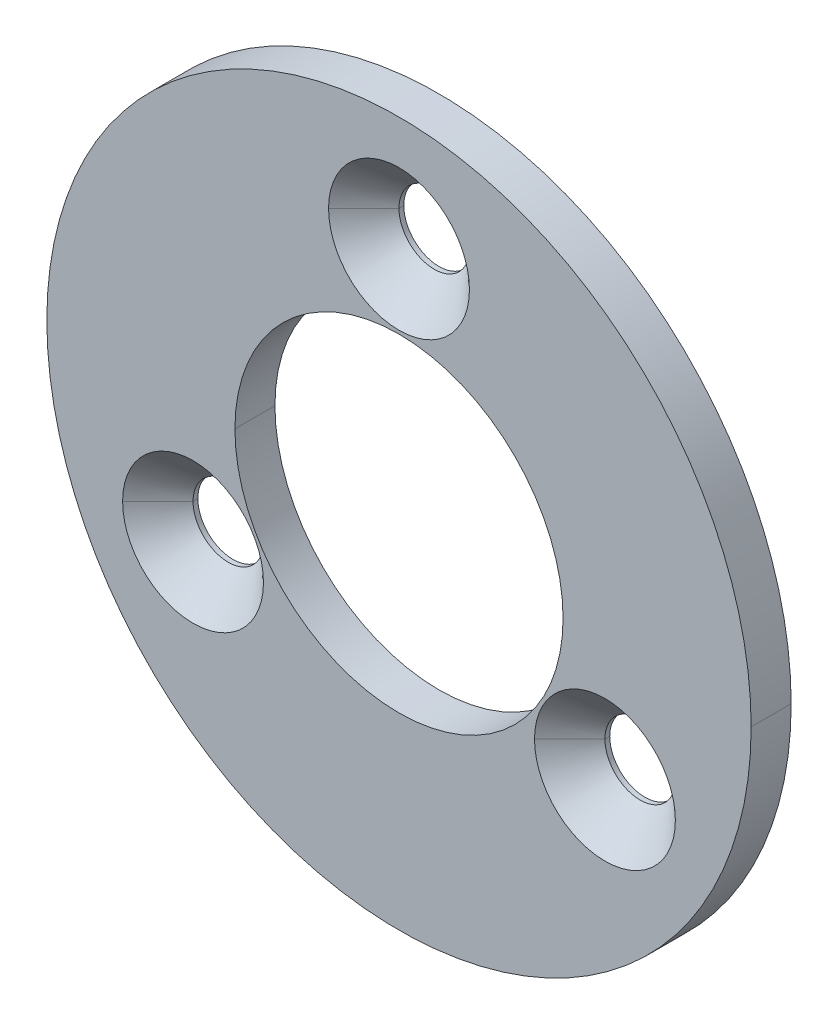
ISO-10303-21;
HEADER;
FILE_DESCRIPTION(('STEP AP214'),'2;1');
FILE_NAME('part.step','',(''),(''),'','','');
FILE_SCHEMA(('AUTOMOTIVE_DESIGN { 1 0 10303 214 1 1 1 1 }'));
ENDSEC;
DATA;
#1=APPLICATION_CONTEXT('core data for automotive mechanical design processes');
#2=APPLICATION_PROTOCOL_DEFINITION('international standard','automotive_design',2000,#1);
#3=PRODUCT_CONTEXT('',#1,'mechanical');
#4=PRODUCT('Part','Part','',(#3));
#5=PRODUCT_RELATED_PRODUCT_CATEGORY('part','',(#4));
#6=PRODUCT_DEFINITION_FORMATION('','',#4);
#7=PRODUCT_DEFINITION_CONTEXT('part definition',#1,'design');
#8=PRODUCT_DEFINITION('design','',#6,#7);
#9=PRODUCT_DEFINITION_SHAPE('','',#8);
#10=(LENGTH_UNIT() NAMED_UNIT(*) SI_UNIT(.MILLI.,.METRE.));
#11=(NAMED_UNIT(*) PLANE_ANGLE_UNIT() SI_UNIT($,.RADIAN.));
#12=(NAMED_UNIT(*) SI_UNIT($,.STERADIAN.) SOLID_ANGLE_UNIT());
#13=UNCERTAINTY_MEASURE_WITH_UNIT(LENGTH_MEASURE(1.E-05),#10,'distance_accuracy_value','');
#14=(GEOMETRIC_REPRESENTATION_CONTEXT(3) GLOBAL_UNCERTAINTY_ASSIGNED_CONTEXT((#13)) GLOBAL_UNIT_ASSIGNED_CONTEXT((#10,
#11,#12)) REPRESENTATION_CONTEXT('',''));
#15=CARTESIAN_POINT('',(0.,0.,0.));
#16=DIRECTION('',(0.,0.,1.));
#17=DIRECTION('',(1.,0.,0.));
#18=AXIS2_PLACEMENT_3D('',#15,#16,#17);
#19=CARTESIAN_POINT('',(0.,7.42820323027552,1.25));
#20=DIRECTION('',(0.,0.,1.));
#21=DIRECTION('',(1.,0.,0.));
#22=AXIS2_PLACEMENT_3D('',#19,#20,#21);
#23=CONICAL_SURFACE('',#22,2.2,0.785398163397449);
#24=DIRECTION('',(-0.707106781186548,0.,0.707106781186547));
#25=VECTOR('',#24,1.);
#26=CARTESIAN_POINT('',(-2.2,7.42820323027552,1.25));
#27=LINE('',#26,#25);
#28=CARTESIAN_POINT('',(-1.1,7.42820323027552,0.150000000000011));
#29=VERTEX_POINT('',#28);
#30=CARTESIAN_POINT('',(-2.2,7.42820323027552,1.25));
#31=VERTEX_POINT('',#30);
#32=EDGE_CURVE('E308',#29,#31,#27,.T.);
#33=ORIENTED_EDGE('',*,*,#32,.F.);
#34=CARTESIAN_POINT('',(0.,7.42820323027552,0.150000000000011));
#35=DIRECTION('',(0.,0.,1.));
#36=DIRECTION('',(1.,0.,0.));
#37=AXIS2_PLACEMENT_3D('',#34,#35,#36);
#38=CIRCLE('',#37,1.1);
#39=CARTESIAN_POINT('',(1.1,7.42820323027552,0.150000000000011));
#40=VERTEX_POINT('',#39);
#41=EDGE_CURVE('E11',#40,#29,#38,.T.);
#42=ORIENTED_EDGE('',*,*,#41,.F.);
#43=DIRECTION('',(0.707106781186548,0.,0.707106781186547));
#44=VECTOR('',#43,1.);
#45=CARTESIAN_POINT('',(2.2,7.42820323027552,1.25));
#46=LINE('',#45,#44);
#47=CARTESIAN_POINT('',(2.2,7.42820323027552,1.25));
#48=VERTEX_POINT('',#47);
#49=EDGE_CURVE('E215',#40,#48,#46,.T.);
#50=ORIENTED_EDGE('',*,*,#49,.T.);
#51=CARTESIAN_POINT('',(0.,7.42820323027552,1.25));
#52=DIRECTION('',(0.,0.,1.));
#53=DIRECTION('',(1.,0.,0.));
#54=AXIS2_PLACEMENT_3D('',#51,#52,#53);
#55=CIRCLE('',#54,2.2);
#56=EDGE_CURVE('E134',#48,#31,#55,.T.);
#57=ORIENTED_EDGE('',*,*,#56,.T.);
#58=EDGE_LOOP('',(#33,#42,#50,#57));
#59=FACE_BOUND('',#58,.T.);
#60=ADVANCED_FACE('F17',(#59),#23,.F.);
#61=CARTESIAN_POINT('',(0.,7.42820323027552,1.25));
#62=DIRECTION('',(0.,0.,1.));
#63=DIRECTION('',(1.,0.,0.));
#64=AXIS2_PLACEMENT_3D('',#61,#62,#63);
#65=CYLINDRICAL_SURFACE('',#64,1.1);
#66=DIRECTION('',(0.,0.,1.));
#67=VECTOR('',#66,1.);
#68=CARTESIAN_POINT('',(-1.1,7.42820323027552,1.25));
#69=LINE('',#68,#67);
#70=CARTESIAN_POINT('',(-1.1,7.42820323027552,0.));
#71=VERTEX_POINT('',#70);
#72=EDGE_CURVE('E271',#71,#29,#69,.T.);
#73=ORIENTED_EDGE('',*,*,#72,.F.);
#74=CARTESIAN_POINT('',(0.,7.42820323027552,0.));
#75=DIRECTION('',(0.,0.,1.));
#76=DIRECTION('',(1.,0.,0.));
#77=AXIS2_PLACEMENT_3D('',#74,#75,#76);
#78=CIRCLE('',#77,1.1);
#79=CARTESIAN_POINT('',(1.1,7.42820323027552,0.));
#80=VERTEX_POINT('',#79);
#81=EDGE_CURVE('E185',#80,#71,#78,.T.);
#82=ORIENTED_EDGE('',*,*,#81,.F.);
#83=DIRECTION('',(0.,0.,1.));
#84=VECTOR('',#83,1.);
#85=CARTESIAN_POINT('',(1.1,7.42820323027552,1.25));
#86=LINE('',#85,#84);
#87=EDGE_CURVE('E274',#80,#40,#86,.T.);
#88=ORIENTED_EDGE('',*,*,#87,.T.);
#89=ORIENTED_EDGE('',*,*,#41,.T.);
#90=EDGE_LOOP('',(#73,#82,#88,#89));
#91=FACE_BOUND('',#90,.T.);
#92=ADVANCED_FACE('F496',(#91),#65,.F.);
#93=CARTESIAN_POINT('',(6.43301270189222,-3.71410161513775,1.25));
#94=DIRECTION('',(0.,0.,1.));
#95=DIRECTION('',(1.,0.,0.));
#96=AXIS2_PLACEMENT_3D('',#93,#94,#95);
#97=CONICAL_SURFACE('',#96,2.2,0.785398163397449);
#98=DIRECTION('',(-0.707106781186548,0.,0.707106781186547));
#99=VECTOR('',#98,1.);
#100=CARTESIAN_POINT('',(4.23301270189222,-3.71410161513775,1.25));
#101=LINE('',#100,#99);
#102=CARTESIAN_POINT('',(5.33301270189222,-3.71410161513775,0.150000000000011));
#103=VERTEX_POINT('',#102);
#104=CARTESIAN_POINT('',(4.23301270189222,-3.71410161513775,1.25));
#105=VERTEX_POINT('',#104);
#106=EDGE_CURVE('E230',#103,#105,#101,.T.);
#107=ORIENTED_EDGE('',*,*,#106,.F.);
#108=CARTESIAN_POINT('',(6.43301270189222,-3.71410161513775,0.150000000000011));
#109=DIRECTION('',(0.,0.,1.));
#110=DIRECTION('',(1.,0.,0.));
#111=AXIS2_PLACEMENT_3D('',#108,#109,#110);
#112=CIRCLE('',#111,1.1);
#113=CARTESIAN_POINT('',(7.53301270189222,-3.71410161513775,0.150000000000011));
#114=VERTEX_POINT('',#113);
#115=EDGE_CURVE('E28',#114,#103,#112,.T.);
#116=ORIENTED_EDGE('',*,*,#115,.F.);
#117=DIRECTION('',(0.707106781186548,0.,0.707106781186547));
#118=VECTOR('',#117,1.);
#119=CARTESIAN_POINT('',(8.63301270189222,-3.71410161513775,1.25));
#120=LINE('',#119,#118);
#121=CARTESIAN_POINT('',(8.63301270189222,-3.71410161513775,1.25));
#122=VERTEX_POINT('',#121);
#123=EDGE_CURVE('E199',#114,#122,#120,.T.);
#124=ORIENTED_EDGE('',*,*,#123,.T.);
#125=CARTESIAN_POINT('',(6.43301270189222,-3.71410161513775,1.25));
#126=DIRECTION('',(0.,0.,1.));
#127=DIRECTION('',(1.,0.,0.));
#128=AXIS2_PLACEMENT_3D('',#125,#126,#127);
#129=CIRCLE('',#128,2.2);
#130=EDGE_CURVE('E69',#122,#105,#129,.T.);
#131=ORIENTED_EDGE('',*,*,#130,.T.);
#132=EDGE_LOOP('',(#107,#116,#124,#131));
#133=FACE_BOUND('',#132,.T.);
#134=ADVANCED_FACE('F492',(#133),#97,.F.);
#135=CARTESIAN_POINT('',(6.43301270189222,-3.71410161513775,1.25));
#136=DIRECTION('',(0.,0.,1.));
#137=DIRECTION('',(1.,0.,0.));
#138=AXIS2_PLACEMENT_3D('',#135,#136,#137);
#139=CYLINDRICAL_SURFACE('',#138,1.1);
#140=DIRECTION('',(0.,0.,1.));
#141=VECTOR('',#140,1.);
#142=CARTESIAN_POINT('',(5.33301270189222,-3.71410161513775,1.25));
#143=LINE('',#142,#141);
#144=CARTESIAN_POINT('',(5.33301270189222,-3.71410161513775,0.));
#145=VERTEX_POINT('',#144);
#146=EDGE_CURVE('E179',#145,#103,#143,.T.);
#147=ORIENTED_EDGE('',*,*,#146,.F.);
#148=CARTESIAN_POINT('',(6.43301270189222,-3.71410161513775,0.));
#149=DIRECTION('',(0.,0.,1.));
#150=DIRECTION('',(1.,0.,0.));
#151=AXIS2_PLACEMENT_3D('',#148,#149,#150);
#152=CIRCLE('',#151,1.1);
#153=CARTESIAN_POINT('',(7.53301270189222,-3.71410161513775,0.));
#154=VERTEX_POINT('',#153);
#155=EDGE_CURVE('E173',#154,#145,#152,.T.);
#156=ORIENTED_EDGE('',*,*,#155,.F.);
#157=DIRECTION('',(0.,0.,1.));
#158=VECTOR('',#157,1.);
#159=CARTESIAN_POINT('',(7.53301270189222,-3.71410161513775,1.25));
#160=LINE('',#159,#158);
#161=EDGE_CURVE('E176',#154,#114,#160,.T.);
#162=ORIENTED_EDGE('',*,*,#161,.T.);
#163=ORIENTED_EDGE('',*,*,#115,.T.);
#164=EDGE_LOOP('',(#147,#156,#162,#163));
#165=FACE_BOUND('',#164,.T.);
#166=ADVANCED_FACE('F175',(#165),#139,.F.);
#167=CARTESIAN_POINT('',(-6.43301270189222,-3.71410161513775,1.25));
#168=DIRECTION('',(0.,0.,1.));
#169=DIRECTION('',(1.,0.,0.));
#170=AXIS2_PLACEMENT_3D('',#167,#168,#169);
#171=CONICAL_SURFACE('',#170,2.2,0.785398163397449);
#172=DIRECTION('',(-0.707106781186548,0.,0.707106781186547));
#173=VECTOR('',#172,1.);
#174=CARTESIAN_POINT('',(-8.63301270189222,-3.71410161513775,1.25));
#175=LINE('',#174,#173);
#176=CARTESIAN_POINT('',(-7.53301270189222,-3.71410161513775,0.150000000000011));
#177=VERTEX_POINT('',#176);
#178=CARTESIAN_POINT('',(-8.63301270189222,-3.71410161513775,1.25));
#179=VERTEX_POINT('',#178);
#180=EDGE_CURVE('E224',#177,#179,#175,.T.);
#181=ORIENTED_EDGE('',*,*,#180,.F.);
#182=CARTESIAN_POINT('',(-6.43301270189222,-3.71410161513775,0.150000000000011));
#183=DIRECTION('',(0.,0.,1.));
#184=DIRECTION('',(1.,0.,0.));
#185=AXIS2_PLACEMENT_3D('',#182,#183,#184);
#186=CIRCLE('',#185,1.1);
#187=CARTESIAN_POINT('',(-5.33301270189222,-3.71410161513775,0.150000000000011));
#188=VERTEX_POINT('',#187);
#189=EDGE_CURVE('E158',#188,#177,#186,.T.);
#190=ORIENTED_EDGE('',*,*,#189,.F.);
#191=DIRECTION('',(0.707106781186548,0.,0.707106781186547));
#192=VECTOR('',#191,1.);
#193=CARTESIAN_POINT('',(-4.23301270189222,-3.71410161513775,1.25));
#194=LINE('',#193,#192);
#195=CARTESIAN_POINT('',(-4.23301270189222,-3.71410161513775,1.25));
#196=VERTEX_POINT('',#195);
#197=EDGE_CURVE('E223',#188,#196,#194,.T.);
#198=ORIENTED_EDGE('',*,*,#197,.T.);
#199=CARTESIAN_POINT('',(-6.43301270189222,-3.71410161513775,1.25));
#200=DIRECTION('',(0.,0.,1.));
#201=DIRECTION('',(1.,0.,0.));
#202=AXIS2_PLACEMENT_3D('',#199,#200,#201);
#203=CIRCLE('',#202,2.2);
#204=EDGE_CURVE('E227',#196,#179,#203,.T.);
#205=ORIENTED_EDGE('',*,*,#204,.T.);
#206=EDGE_LOOP('',(#181,#190,#198,#205));
#207=FACE_BOUND('',#206,.T.);
#208=ADVANCED_FACE('F19',(#207),#171,.F.);
#209=CARTESIAN_POINT('',(-6.43301270189222,-3.71410161513775,1.25));
#210=DIRECTION('',(0.,0.,1.));
#211=DIRECTION('',(1.,0.,0.));
#212=AXIS2_PLACEMENT_3D('',#209,#210,#211);
#213=CYLINDRICAL_SURFACE('',#212,1.1);
#214=DIRECTION('',(0.,0.,1.));
#215=VECTOR('',#214,1.);
#216=CARTESIAN_POINT('',(-7.53301270189222,-3.71410161513775,1.25));
#217=LINE('',#216,#215);
#218=CARTESIAN_POINT('',(-7.53301270189222,-3.71410161513775,0.));
#219=VERTEX_POINT('',#218);
#220=EDGE_CURVE('E298',#219,#177,#217,.T.);
#221=ORIENTED_EDGE('',*,*,#220,.F.);
#222=CARTESIAN_POINT('',(-6.43301270189222,-3.71410161513775,0.));
#223=DIRECTION('',(0.,0.,1.));
#224=DIRECTION('',(1.,0.,0.));
#225=AXIS2_PLACEMENT_3D('',#222,#223,#224);
#226=CIRCLE('',#225,1.1);
#227=CARTESIAN_POINT('',(-5.33301270189222,-3.71410161513775,0.));
#228=VERTEX_POINT('',#227);
#229=EDGE_CURVE('E184',#228,#219,#226,.T.);
#230=ORIENTED_EDGE('',*,*,#229,.F.);
#231=DIRECTION('',(0.,0.,1.));
#232=VECTOR('',#231,1.);
#233=CARTESIAN_POINT('',(-5.33301270189222,-3.71410161513775,1.25));
#234=LINE('',#233,#232);
#235=EDGE_CURVE('E295',#228,#188,#234,.T.);
#236=ORIENTED_EDGE('',*,*,#235,.T.);
#237=ORIENTED_EDGE('',*,*,#189,.T.);
#238=EDGE_LOOP('',(#221,#230,#236,#237));
#239=FACE_BOUND('',#238,.T.);
#240=ADVANCED_FACE('F506',(#239),#213,.F.);
#241=CARTESIAN_POINT('',(0.,0.,1.25));
#242=DIRECTION('',(0.,0.,-1.));
#243=DIRECTION('',(-1.,0.,0.));
#244=AXIS2_PLACEMENT_3D('',#241,#242,#243);
#245=CYLINDRICAL_SURFACE('',#244,5.125);
#246=DIRECTION('',(0.,0.,-1.));
#247=VECTOR('',#246,1.);
#248=CARTESIAN_POINT('',(5.125,0.,1.25));
#249=LINE('',#248,#247);
#250=CARTESIAN_POINT('',(5.125,0.,1.25));
#251=VERTEX_POINT('',#250);
#252=CARTESIAN_POINT('',(5.125,0.,0.));
#253=VERTEX_POINT('',#252);
#254=EDGE_CURVE('E262',#251,#253,#249,.T.);
#255=ORIENTED_EDGE('',*,*,#254,.F.);
#256=CARTESIAN_POINT('',(0.,0.,1.25));
#257=DIRECTION('',(0.,0.,1.));
#258=DIRECTION('',(1.,0.,0.));
#259=AXIS2_PLACEMENT_3D('',#256,#257,#258);
#260=CIRCLE('',#259,5.125);
#261=CARTESIAN_POINT('',(-5.125,0.,1.25));
#262=VERTEX_POINT('',#261);
#263=EDGE_CURVE('E214',#251,#262,#260,.T.);
#264=ORIENTED_EDGE('',*,*,#263,.T.);
#265=DIRECTION('',(0.,0.,-1.));
#266=VECTOR('',#265,1.);
#267=CARTESIAN_POINT('',(-5.125,0.,1.25));
#268=LINE('',#267,#266);
#269=CARTESIAN_POINT('',(-5.125,0.,0.));
#270=VERTEX_POINT('',#269);
#271=EDGE_CURVE('E270',#262,#270,#268,.T.);
#272=ORIENTED_EDGE('',*,*,#271,.T.);
#273=CARTESIAN_POINT('',(0.,0.,0.));
#274=DIRECTION('',(0.,0.,1.));
#275=DIRECTION('',(1.,0.,0.));
#276=AXIS2_PLACEMENT_3D('',#273,#274,#275);
#277=CIRCLE('',#276,5.125);
#278=EDGE_CURVE('E236',#253,#270,#277,.T.);
#279=ORIENTED_EDGE('',*,*,#278,.F.);
#280=EDGE_LOOP('',(#255,#264,#272,#279));
#281=FACE_BOUND('',#280,.T.);
#282=ADVANCED_FACE('F501',(#281),#245,.F.);
#283=CARTESIAN_POINT('',(0.,0.,1.25));
#284=DIRECTION('',(0.,0.,-1.));
#285=DIRECTION('',(-1.,0.,0.));
#286=AXIS2_PLACEMENT_3D('',#283,#284,#285);
#287=CYLINDRICAL_SURFACE('',#286,11.);
#288=DIRECTION('',(0.,0.,-1.));
#289=VECTOR('',#288,1.);
#290=CARTESIAN_POINT('',(11.,0.,1.25));
#291=LINE('',#290,#289);
#292=CARTESIAN_POINT('',(11.,0.,1.25));
#293=VERTEX_POINT('',#292);
#294=CARTESIAN_POINT('',(11.,0.,0.));
#295=VERTEX_POINT('',#294);
#296=EDGE_CURVE('E276',#293,#295,#291,.T.);
#297=ORIENTED_EDGE('',*,*,#296,.F.);
#298=CARTESIAN_POINT('',(0.,0.,1.25));
#299=DIRECTION('',(0.,0.,1.));
#300=DIRECTION('',(1.,0.,0.));
#301=AXIS2_PLACEMENT_3D('',#298,#299,#300);
#302=CIRCLE('',#301,11.);
#303=CARTESIAN_POINT('',(-11.,0.,1.25));
#304=VERTEX_POINT('',#303);
#305=EDGE_CURVE('E258',#304,#293,#302,.T.);
#306=ORIENTED_EDGE('',*,*,#305,.F.);
#307=DIRECTION('',(0.,0.,-1.));
#308=VECTOR('',#307,1.);
#309=CARTESIAN_POINT('',(-11.,0.,1.25));
#310=LINE('',#309,#308);
#311=CARTESIAN_POINT('',(-11.,0.,0.));
#312=VERTEX_POINT('',#311);
#313=EDGE_CURVE('E255',#304,#312,#310,.T.);
#314=ORIENTED_EDGE('',*,*,#313,.T.);
#315=CARTESIAN_POINT('',(0.,0.,0.));
#316=DIRECTION('',(0.,0.,1.));
#317=DIRECTION('',(1.,0.,0.));
#318=AXIS2_PLACEMENT_3D('',#315,#316,#317);
#319=CIRCLE('',#318,11.);
#320=EDGE_CURVE('E42',#312,#295,#319,.T.);
#321=ORIENTED_EDGE('',*,*,#320,.T.);
#322=EDGE_LOOP('',(#297,#306,#314,#321));
#323=FACE_BOUND('',#322,.T.);
#324=ADVANCED_FACE('F505',(#323),#287,.T.);
#325=CARTESIAN_POINT('',(0.,0.,0.));
#326=DIRECTION('',(0.,0.,1.));
#327=DIRECTION('',(0.,-1.,0.));
#328=AXIS2_PLACEMENT_3D('',#325,#326,#327);
#329=PLANE('',#328);
#330=CARTESIAN_POINT('',(0.,0.,0.));
#331=DIRECTION('',(0.,0.,1.));
#332=DIRECTION('',(1.,0.,0.));
#333=AXIS2_PLACEMENT_3D('',#330,#331,#332);
#334=CIRCLE('',#333,5.125);
#335=EDGE_CURVE('E266',#270,#253,#334,.T.);
#336=ORIENTED_EDGE('',*,*,#335,.T.);
#337=ORIENTED_EDGE('',*,*,#278,.T.);
#338=EDGE_LOOP('',(#336,#337));
#339=FACE_BOUND('',#338,.T.);
#340=ORIENTED_EDGE('',*,*,#229,.T.);
#341=CARTESIAN_POINT('',(-6.43301270189222,-3.71410161513775,0.));
#342=DIRECTION('',(0.,0.,1.));
#343=DIRECTION('',(1.,0.,0.));
#344=AXIS2_PLACEMENT_3D('',#341,#342,#343);
#345=CIRCLE('',#344,1.1);
#346=EDGE_CURVE('E304',#219,#228,#345,.T.);
#347=ORIENTED_EDGE('',*,*,#346,.T.);
#348=EDGE_LOOP('',(#340,#347));
#349=FACE_BOUND('',#348,.T.);
#350=ORIENTED_EDGE('',*,*,#155,.T.);
#351=CARTESIAN_POINT('',(6.43301270189222,-3.71410161513775,0.));
#352=DIRECTION('',(0.,0.,1.));
#353=DIRECTION('',(1.,0.,0.));
#354=AXIS2_PLACEMENT_3D('',#351,#352,#353);
#355=CIRCLE('',#354,1.1);
#356=EDGE_CURVE('E190',#145,#154,#355,.T.);
#357=ORIENTED_EDGE('',*,*,#356,.T.);
#358=EDGE_LOOP('',(#350,#357));
#359=FACE_BOUND('',#358,.T.);
#360=ORIENTED_EDGE('',*,*,#81,.T.);
#361=CARTESIAN_POINT('',(0.,7.42820323027552,0.));
#362=DIRECTION('',(0.,0.,1.));
#363=DIRECTION('',(1.,0.,0.));
#364=AXIS2_PLACEMENT_3D('',#361,#362,#363);
#365=CIRCLE('',#364,1.1);
#366=EDGE_CURVE('E21',#71,#80,#365,.T.);
#367=ORIENTED_EDGE('',*,*,#366,.T.);
#368=EDGE_LOOP('',(#360,#367));
#369=FACE_BOUND('',#368,.T.);
#370=ORIENTED_EDGE('',*,*,#320,.F.);
#371=CARTESIAN_POINT('',(0.,0.,0.));
#372=DIRECTION('',(0.,0.,1.));
#373=DIRECTION('',(1.,0.,0.));
#374=AXIS2_PLACEMENT_3D('',#371,#372,#373);
#375=CIRCLE('',#374,11.);
#376=EDGE_CURVE('E259',#295,#312,#375,.T.);
#377=ORIENTED_EDGE('',*,*,#376,.F.);
#378=EDGE_LOOP('',(#370,#377));
#379=FACE_BOUND('',#378,.T.);
#380=ADVANCED_FACE('F196',(#339,#349,#359,#369,#379),#329,.F.);
#381=CARTESIAN_POINT('',(0.,0.,1.25));
#382=DIRECTION('',(0.,0.,1.));
#383=DIRECTION('',(0.,-1.,0.));
#384=AXIS2_PLACEMENT_3D('',#381,#382,#383);
#385=PLANE('',#384);
#386=CARTESIAN_POINT('',(0.,0.,1.25));
#387=DIRECTION('',(0.,0.,1.));
#388=DIRECTION('',(1.,0.,0.));
#389=AXIS2_PLACEMENT_3D('',#386,#387,#388);
#390=CIRCLE('',#389,5.125);
#391=EDGE_CURVE('E210',#262,#251,#390,.T.);
#392=ORIENTED_EDGE('',*,*,#391,.F.);
#393=ORIENTED_EDGE('',*,*,#263,.F.);
#394=EDGE_LOOP('',(#392,#393));
#395=FACE_BOUND('',#394,.T.);
#396=ORIENTED_EDGE('',*,*,#204,.F.);
#397=CARTESIAN_POINT('',(-6.43301270189222,-3.71410161513775,1.25));
#398=DIRECTION('',(0.,0.,1.));
#399=DIRECTION('',(1.,0.,0.));
#400=AXIS2_PLACEMENT_3D('',#397,#398,#399);
#401=CIRCLE('',#400,2.2);
#402=EDGE_CURVE('E219',#179,#196,#401,.T.);
#403=ORIENTED_EDGE('',*,*,#402,.F.);
#404=EDGE_LOOP('',(#396,#403));
#405=FACE_BOUND('',#404,.T.);
#406=ORIENTED_EDGE('',*,*,#130,.F.);
#407=CARTESIAN_POINT('',(6.43301270189222,-3.71410161513775,1.25));
#408=DIRECTION('',(0.,0.,1.));
#409=DIRECTION('',(1.,0.,0.));
#410=AXIS2_PLACEMENT_3D('',#407,#408,#409);
#411=CIRCLE('',#410,2.2);
#412=EDGE_CURVE('E207',#105,#122,#411,.T.);
#413=ORIENTED_EDGE('',*,*,#412,.F.);
#414=EDGE_LOOP('',(#406,#413));
#415=FACE_BOUND('',#414,.T.);
#416=ORIENTED_EDGE('',*,*,#56,.F.);
#417=CARTESIAN_POINT('',(0.,7.42820323027552,1.25));
#418=DIRECTION('',(0.,0.,1.));
#419=DIRECTION('',(1.,0.,0.));
#420=AXIS2_PLACEMENT_3D('',#417,#418,#419);
#421=CIRCLE('',#420,2.2);
#422=EDGE_CURVE('E218',#31,#48,#421,.T.);
#423=ORIENTED_EDGE('',*,*,#422,.F.);
#424=EDGE_LOOP('',(#416,#423));
#425=FACE_BOUND('',#424,.T.);
#426=ORIENTED_EDGE('',*,*,#305,.T.);
#427=CARTESIAN_POINT('',(0.,0.,1.25));
#428=DIRECTION('',(0.,0.,1.));
#429=DIRECTION('',(1.,0.,0.));
#430=AXIS2_PLACEMENT_3D('',#427,#428,#429);
#431=CIRCLE('',#430,11.);
#432=EDGE_CURVE('E280',#293,#304,#431,.T.);
#433=ORIENTED_EDGE('',*,*,#432,.T.);
#434=EDGE_LOOP('',(#426,#433));
#435=FACE_BOUND('',#434,.T.);
#436=ADVANCED_FACE('F530',(#395,#405,#415,#425,#435),#385,.T.);
#437=CARTESIAN_POINT('',(0.,0.,1.25));
#438=DIRECTION('',(0.,0.,-1.));
#439=DIRECTION('',(-1.,0.,0.));
#440=AXIS2_PLACEMENT_3D('',#437,#438,#439);
#441=CYLINDRICAL_SURFACE('',#440,11.);
#442=ORIENTED_EDGE('',*,*,#432,.F.);
#443=ORIENTED_EDGE('',*,*,#296,.T.);
#444=ORIENTED_EDGE('',*,*,#376,.T.);
#445=ORIENTED_EDGE('',*,*,#313,.F.);
#446=EDGE_LOOP('',(#442,#443,#444,#445));
#447=FACE_BOUND('',#446,.T.);
#448=ADVANCED_FACE('F539',(#447),#441,.T.);
#449=CARTESIAN_POINT('',(0.,0.,1.25));
#450=DIRECTION('',(0.,0.,-1.));
#451=DIRECTION('',(-1.,0.,0.));
#452=AXIS2_PLACEMENT_3D('',#449,#450,#451);
#453=CYLINDRICAL_SURFACE('',#452,5.125);
#454=ORIENTED_EDGE('',*,*,#391,.T.);
#455=ORIENTED_EDGE('',*,*,#254,.T.);
#456=ORIENTED_EDGE('',*,*,#335,.F.);
#457=ORIENTED_EDGE('',*,*,#271,.F.);
#458=EDGE_LOOP('',(#454,#455,#456,#457));
#459=FACE_BOUND('',#458,.T.);
#460=ADVANCED_FACE('F565',(#459),#453,.F.);
#461=CARTESIAN_POINT('',(-6.43301270189222,-3.71410161513775,1.25));
#462=DIRECTION('',(0.,0.,1.));
#463=DIRECTION('',(1.,0.,0.));
#464=AXIS2_PLACEMENT_3D('',#461,#462,#463);
#465=CYLINDRICAL_SURFACE('',#464,1.1);
#466=ORIENTED_EDGE('',*,*,#346,.F.);
#467=ORIENTED_EDGE('',*,*,#220,.T.);
#468=CARTESIAN_POINT('',(-6.43301270189222,-3.71410161513775,0.150000000000011));
#469=DIRECTION('',(0.,0.,1.));
#470=DIRECTION('',(1.,0.,0.));
#471=AXIS2_PLACEMENT_3D('',#468,#469,#470);
#472=CIRCLE('',#471,1.1);
#473=EDGE_CURVE('E194',#177,#188,#472,.T.);
#474=ORIENTED_EDGE('',*,*,#473,.T.);
#475=ORIENTED_EDGE('',*,*,#235,.F.);
#476=EDGE_LOOP('',(#466,#467,#474,#475));
#477=FACE_BOUND('',#476,.T.);
#478=ADVANCED_FACE('F575',(#477),#465,.F.);
#479=CARTESIAN_POINT('',(-6.43301270189222,-3.71410161513775,1.25));
#480=DIRECTION('',(0.,0.,1.));
#481=DIRECTION('',(1.,0.,0.));
#482=AXIS2_PLACEMENT_3D('',#479,#480,#481);
#483=CONICAL_SURFACE('',#482,2.2,0.785398163397449);
#484=ORIENTED_EDGE('',*,*,#473,.F.);
#485=ORIENTED_EDGE('',*,*,#180,.T.);
#486=ORIENTED_EDGE('',*,*,#402,.T.);
#487=ORIENTED_EDGE('',*,*,#197,.F.);
#488=EDGE_LOOP('',(#484,#485,#486,#487));
#489=FACE_BOUND('',#488,.T.);
#490=ADVANCED_FACE('F571',(#489),#483,.F.);
#491=CARTESIAN_POINT('',(6.43301270189222,-3.71410161513775,1.25));
#492=DIRECTION('',(0.,0.,1.));
#493=DIRECTION('',(1.,0.,0.));
#494=AXIS2_PLACEMENT_3D('',#491,#492,#493);
#495=CYLINDRICAL_SURFACE('',#494,1.1);
#496=ORIENTED_EDGE('',*,*,#356,.F.);
#497=ORIENTED_EDGE('',*,*,#146,.T.);
#498=CARTESIAN_POINT('',(6.43301270189222,-3.71410161513775,0.150000000000011));
#499=DIRECTION('',(0.,0.,1.));
#500=DIRECTION('',(1.,0.,0.));
#501=AXIS2_PLACEMENT_3D('',#498,#499,#500);
#502=CIRCLE('',#501,1.1);
#503=EDGE_CURVE('E192',#103,#114,#502,.T.);
#504=ORIENTED_EDGE('',*,*,#503,.T.);
#505=ORIENTED_EDGE('',*,*,#161,.F.);
#506=EDGE_LOOP('',(#496,#497,#504,#505));
#507=FACE_BOUND('',#506,.T.);
#508=ADVANCED_FACE('F189',(#507),#495,.F.);
#509=CARTESIAN_POINT('',(6.43301270189222,-3.71410161513775,1.25));
#510=DIRECTION('',(0.,0.,1.));
#511=DIRECTION('',(1.,0.,0.));
#512=AXIS2_PLACEMENT_3D('',#509,#510,#511);
#513=CONICAL_SURFACE('',#512,2.2,0.785398163397449);
#514=ORIENTED_EDGE('',*,*,#503,.F.);
#515=ORIENTED_EDGE('',*,*,#106,.T.);
#516=ORIENTED_EDGE('',*,*,#412,.T.);
#517=ORIENTED_EDGE('',*,*,#123,.F.);
#518=EDGE_LOOP('',(#514,#515,#516,#517));
#519=FACE_BOUND('',#518,.T.);
#520=ADVANCED_FACE('F590',(#519),#513,.F.);
#521=CARTESIAN_POINT('',(0.,7.42820323027552,1.25));
#522=DIRECTION('',(0.,0.,1.));
#523=DIRECTION('',(1.,0.,0.));
#524=AXIS2_PLACEMENT_3D('',#521,#522,#523);
#525=CYLINDRICAL_SURFACE('',#524,1.1);
#526=ORIENTED_EDGE('',*,*,#366,.F.);
#527=ORIENTED_EDGE('',*,*,#72,.T.);
#528=CARTESIAN_POINT('',(0.,7.42820323027552,0.150000000000011));
#529=DIRECTION('',(0.,0.,1.));
#530=DIRECTION('',(1.,0.,0.));
#531=AXIS2_PLACEMENT_3D('',#528,#529,#530);
#532=CIRCLE('',#531,1.1);
#533=EDGE_CURVE('E314',#29,#40,#532,.T.);
#534=ORIENTED_EDGE('',*,*,#533,.T.);
#535=ORIENTED_EDGE('',*,*,#87,.F.);
#536=EDGE_LOOP('',(#526,#527,#534,#535));
#537=FACE_BOUND('',#536,.T.);
#538=ADVANCED_FACE('F549',(#537),#525,.F.);
#539=CARTESIAN_POINT('',(0.,7.42820323027552,1.25));
#540=DIRECTION('',(0.,0.,1.));
#541=DIRECTION('',(1.,0.,0.));
#542=AXIS2_PLACEMENT_3D('',#539,#540,#541);
#543=CONICAL_SURFACE('',#542,2.2,0.785398163397449);
#544=ORIENTED_EDGE('',*,*,#533,.F.);
#545=ORIENTED_EDGE('',*,*,#32,.T.);
#546=ORIENTED_EDGE('',*,*,#422,.T.);
#547=ORIENTED_EDGE('',*,*,#49,.F.);
#548=EDGE_LOOP('',(#544,#545,#546,#547));
#549=FACE_BOUND('',#548,.T.);
#550=ADVANCED_FACE('F545',(#549),#543,.F.);
#551=CLOSED_SHELL('',(#60,#92,#134,#166,#208,#240,#282,#324,#380,#436,#448,#460,#478,#490,#508,
#520,#538,#550));
#552=MANIFOLD_SOLID_BREP('B1',#551);
#553=ADVANCED_BREP_SHAPE_REPRESENTATION('',(#18,#552),#14);
#554=SHAPE_DEFINITION_REPRESENTATION(#9,#553);
ENDSEC;
END-ISO-10303-21;
